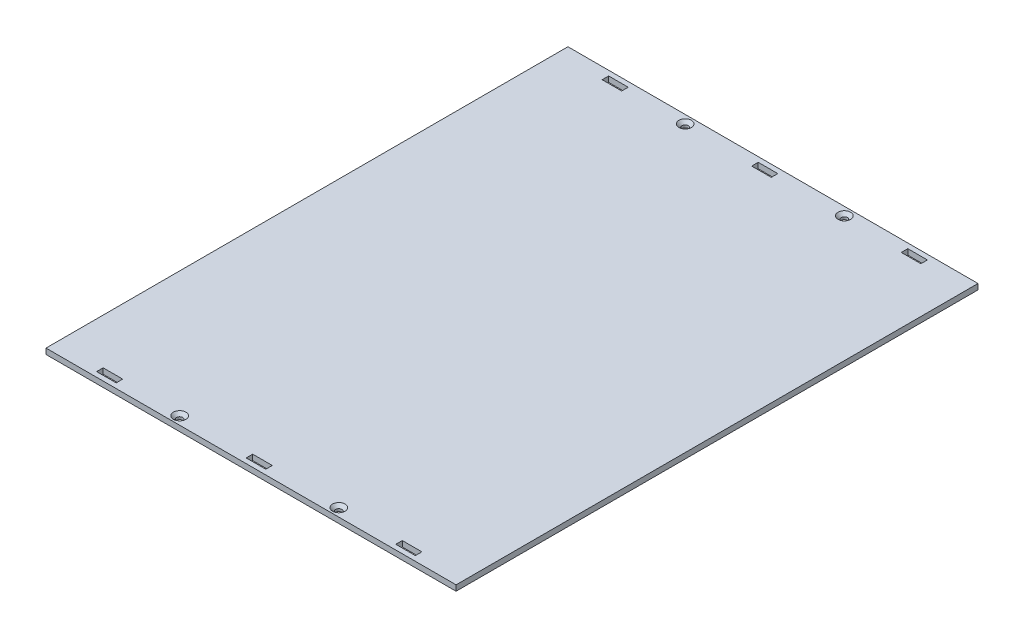
ISO-10303-21;
HEADER;
FILE_DESCRIPTION(('STEP AP214'),'2;1');
FILE_NAME('part.step','',(''),(''),'','','');
FILE_SCHEMA(('AUTOMOTIVE_DESIGN { 1 0 10303 214 1 1 1 1 }'));
ENDSEC;
DATA;
#1=APPLICATION_CONTEXT('core data for automotive mechanical design processes');
#2=APPLICATION_PROTOCOL_DEFINITION('international standard','automotive_design',2000,#1);
#3=PRODUCT_CONTEXT('',#1,'mechanical');
#4=PRODUCT('Part','Part','',(#3));
#5=PRODUCT_RELATED_PRODUCT_CATEGORY('part','',(#4));
#6=PRODUCT_DEFINITION_FORMATION('','',#4);
#7=PRODUCT_DEFINITION_CONTEXT('part definition',#1,'design');
#8=PRODUCT_DEFINITION('design','',#6,#7);
#9=PRODUCT_DEFINITION_SHAPE('','',#8);
#10=(LENGTH_UNIT() NAMED_UNIT(*) SI_UNIT(.MILLI.,.METRE.));
#11=(NAMED_UNIT(*) PLANE_ANGLE_UNIT() SI_UNIT($,.RADIAN.));
#12=(NAMED_UNIT(*) SI_UNIT($,.STERADIAN.) SOLID_ANGLE_UNIT());
#13=UNCERTAINTY_MEASURE_WITH_UNIT(LENGTH_MEASURE(1.E-05),#10,'distance_accuracy_value','');
#14=(GEOMETRIC_REPRESENTATION_CONTEXT(3) GLOBAL_UNCERTAINTY_ASSIGNED_CONTEXT((#13)) GLOBAL_UNIT_ASSIGNED_CONTEXT((#10,
#11,#12)) REPRESENTATION_CONTEXT('',''));
#15=CARTESIAN_POINT('',(0.,0.,0.));
#16=DIRECTION('',(0.,0.,1.));
#17=DIRECTION('',(1.,0.,0.));
#18=AXIS2_PLACEMENT_3D('',#15,#16,#17);
#19=CARTESIAN_POINT('',(0.,3.,0.));
#20=DIRECTION('',(0.,1.,0.));
#21=DIRECTION('',(0.,0.,1.));
#22=AXIS2_PLACEMENT_3D('',#19,#20,#21);
#23=PLANE('',#22);
#24=CARTESIAN_POINT('',(-42.7000000000001,3.,135.6));
#25=DIRECTION('',(0.,1.,0.));
#26=DIRECTION('',(0.,0.,1.));
#27=AXIS2_PLACEMENT_3D('',#24,#25,#26);
#28=CIRCLE('',#27,3.36);
#29=CARTESIAN_POINT('',(-42.7000000000001,3.,138.96));
#30=VERTEX_POINT('',#29);
#31=EDGE_CURVE('E801',#30,#30,#28,.T.);
#32=ORIENTED_EDGE('',*,*,#31,.F.);
#33=EDGE_LOOP('',(#32));
#34=FACE_BOUND('',#33,.T.);
#35=CARTESIAN_POINT('',(42.7,3.,135.6));
#36=DIRECTION('',(0.,1.,0.));
#37=DIRECTION('',(0.,0.,1.));
#38=AXIS2_PLACEMENT_3D('',#35,#36,#37);
#39=CIRCLE('',#38,3.36);
#40=CARTESIAN_POINT('',(42.7,3.,138.96));
#41=VERTEX_POINT('',#40);
#42=EDGE_CURVE('E808',#41,#41,#39,.T.);
#43=ORIENTED_EDGE('',*,*,#42,.F.);
#44=EDGE_LOOP('',(#43));
#45=FACE_BOUND('',#44,.T.);
#46=CARTESIAN_POINT('',(-42.7000000000001,3.,-135.6));
#47=DIRECTION('',(0.,1.,0.));
#48=DIRECTION('',(0.,0.,1.));
#49=AXIS2_PLACEMENT_3D('',#46,#47,#48);
#50=CIRCLE('',#49,3.36);
#51=CARTESIAN_POINT('',(-42.7000000000001,3.,-132.24));
#52=VERTEX_POINT('',#51);
#53=EDGE_CURVE('E817',#52,#52,#50,.T.);
#54=ORIENTED_EDGE('',*,*,#53,.F.);
#55=EDGE_LOOP('',(#54));
#56=FACE_BOUND('',#55,.T.);
#57=CARTESIAN_POINT('',(42.6999999999999,3.,-135.6));
#58=DIRECTION('',(0.,1.,0.));
#59=DIRECTION('',(0.,0.,1.));
#60=AXIS2_PLACEMENT_3D('',#57,#58,#59);
#61=CIRCLE('',#60,3.36);
#62=CARTESIAN_POINT('',(42.6999999999999,3.,-132.24));
#63=VERTEX_POINT('',#62);
#64=EDGE_CURVE('E826',#63,#63,#61,.T.);
#65=ORIENTED_EDGE('',*,*,#64,.F.);
#66=EDGE_LOOP('',(#65));
#67=FACE_BOUND('',#66,.T.);
#68=DIRECTION('',(0.,0.,1.));
#69=VECTOR('',#68,1.);
#70=CARTESIAN_POINT('',(-85.5,3.,-137.350000000001));
#71=LINE('',#70,#69);
#72=CARTESIAN_POINT('',(-85.5,3.,-137.350000000001));
#73=VERTEX_POINT('',#72);
#74=CARTESIAN_POINT('',(-85.5,3.,-133.850000000001));
#75=VERTEX_POINT('',#74);
#76=EDGE_CURVE('E232',#73,#75,#71,.T.);
#77=ORIENTED_EDGE('',*,*,#76,.F.);
#78=DIRECTION('',(-1.,0.,0.));
#79=VECTOR('',#78,1.);
#80=CARTESIAN_POINT('',(-85.5,3.,-137.350000000001));
#81=LINE('',#80,#79);
#82=CARTESIAN_POINT('',(-75.0000000000001,3.,-137.350000000001));
#83=VERTEX_POINT('',#82);
#84=EDGE_CURVE('E224',#83,#73,#81,.T.);
#85=ORIENTED_EDGE('',*,*,#84,.F.);
#86=DIRECTION('',(0.,0.,-1.));
#87=VECTOR('',#86,1.);
#88=CARTESIAN_POINT('',(-75.0000000000001,3.,-137.350000000001));
#89=LINE('',#88,#87);
#90=CARTESIAN_POINT('',(-75.0000000000001,3.,-133.850000000001));
#91=VERTEX_POINT('',#90);
#92=EDGE_CURVE('E247',#91,#83,#89,.T.);
#93=ORIENTED_EDGE('',*,*,#92,.F.);
#94=DIRECTION('',(1.,0.,0.));
#95=VECTOR('',#94,1.);
#96=CARTESIAN_POINT('',(-85.5,3.,-133.850000000001));
#97=LINE('',#96,#95);
#98=EDGE_CURVE('E245',#75,#91,#97,.T.);
#99=ORIENTED_EDGE('',*,*,#98,.F.);
#100=EDGE_LOOP('',(#77,#85,#93,#99));
#101=FACE_BOUND('',#100,.T.);
#102=DIRECTION('',(0.,0.,1.));
#103=VECTOR('',#102,1.);
#104=CARTESIAN_POINT('',(-5.25000000000006,3.,-137.35));
#105=LINE('',#104,#103);
#106=CARTESIAN_POINT('',(-5.25000000000006,3.,-137.35));
#107=VERTEX_POINT('',#106);
#108=CARTESIAN_POINT('',(-5.25000000000006,3.,-133.85));
#109=VERTEX_POINT('',#108);
#110=EDGE_CURVE('E296',#107,#109,#105,.T.);
#111=ORIENTED_EDGE('',*,*,#110,.F.);
#112=DIRECTION('',(-1.,0.,0.));
#113=VECTOR('',#112,1.);
#114=CARTESIAN_POINT('',(-5.25000000000006,3.,-137.35));
#115=LINE('',#114,#113);
#116=CARTESIAN_POINT('',(5.24999999999994,3.,-137.35));
#117=VERTEX_POINT('',#116);
#118=EDGE_CURVE('E294',#117,#107,#115,.T.);
#119=ORIENTED_EDGE('',*,*,#118,.F.);
#120=DIRECTION('',(0.,0.,-1.));
#121=VECTOR('',#120,1.);
#122=CARTESIAN_POINT('',(5.24999999999994,3.,-137.35));
#123=LINE('',#122,#121);
#124=CARTESIAN_POINT('',(5.24999999999995,3.,-133.85));
#125=VERTEX_POINT('',#124);
#126=EDGE_CURVE('E302',#125,#117,#123,.T.);
#127=ORIENTED_EDGE('',*,*,#126,.F.);
#128=DIRECTION('',(1.,0.,0.));
#129=VECTOR('',#128,1.);
#130=CARTESIAN_POINT('',(-5.25000000000006,3.,-133.85));
#131=LINE('',#130,#129);
#132=EDGE_CURVE('E299',#109,#125,#131,.T.);
#133=ORIENTED_EDGE('',*,*,#132,.F.);
#134=EDGE_LOOP('',(#111,#119,#127,#133));
#135=FACE_BOUND('',#134,.T.);
#136=DIRECTION('',(0.,0.,-1.));
#137=VECTOR('',#136,1.);
#138=CARTESIAN_POINT('',(85.5,3.,137.350000000001));
#139=LINE('',#138,#137);
#140=CARTESIAN_POINT('',(85.5,3.,137.350000000001));
#141=VERTEX_POINT('',#140);
#142=CARTESIAN_POINT('',(85.5,3.,133.850000000001));
#143=VERTEX_POINT('',#142);
#144=EDGE_CURVE('E327',#141,#143,#139,.T.);
#145=ORIENTED_EDGE('',*,*,#144,.F.);
#146=DIRECTION('',(1.,0.,0.));
#147=VECTOR('',#146,1.);
#148=CARTESIAN_POINT('',(85.5,3.,137.350000000001));
#149=LINE('',#148,#147);
#150=CARTESIAN_POINT('',(75.,3.,137.350000000001));
#151=VERTEX_POINT('',#150);
#152=EDGE_CURVE('E325',#151,#141,#149,.T.);
#153=ORIENTED_EDGE('',*,*,#152,.F.);
#154=DIRECTION('',(0.,0.,1.));
#155=VECTOR('',#154,1.);
#156=CARTESIAN_POINT('',(75.,3.,137.350000000001));
#157=LINE('',#156,#155);
#158=CARTESIAN_POINT('',(75.,3.,133.850000000001));
#159=VERTEX_POINT('',#158);
#160=EDGE_CURVE('E333',#159,#151,#157,.T.);
#161=ORIENTED_EDGE('',*,*,#160,.F.);
#162=DIRECTION('',(-1.,0.,0.));
#163=VECTOR('',#162,1.);
#164=CARTESIAN_POINT('',(85.5,3.,133.850000000001));
#165=LINE('',#164,#163);
#166=EDGE_CURVE('E330',#143,#159,#165,.T.);
#167=ORIENTED_EDGE('',*,*,#166,.F.);
#168=EDGE_LOOP('',(#145,#153,#161,#167));
#169=FACE_BOUND('',#168,.T.);
#170=DIRECTION('',(-1.,0.,0.));
#171=VECTOR('',#170,1.);
#172=CARTESIAN_POINT('',(-85.5,3.,133.850000000001));
#173=LINE('',#172,#171);
#174=CARTESIAN_POINT('',(-75.,3.,133.850000000001));
#175=VERTEX_POINT('',#174);
#176=CARTESIAN_POINT('',(-85.5,3.,133.850000000001));
#177=VERTEX_POINT('',#176);
#178=EDGE_CURVE('E358',#175,#177,#173,.T.);
#179=ORIENTED_EDGE('',*,*,#178,.F.);
#180=DIRECTION('',(0.,0.,-1.));
#181=VECTOR('',#180,1.);
#182=CARTESIAN_POINT('',(-75.,3.,137.350000000001));
#183=LINE('',#182,#181);
#184=CARTESIAN_POINT('',(-75.,3.,137.350000000001));
#185=VERTEX_POINT('',#184);
#186=EDGE_CURVE('E356',#185,#175,#183,.T.);
#187=ORIENTED_EDGE('',*,*,#186,.F.);
#188=DIRECTION('',(1.,0.,0.));
#189=VECTOR('',#188,1.);
#190=CARTESIAN_POINT('',(-85.5,3.,137.350000000001));
#191=LINE('',#190,#189);
#192=CARTESIAN_POINT('',(-85.5,3.,137.350000000001));
#193=VERTEX_POINT('',#192);
#194=EDGE_CURVE('E364',#193,#185,#191,.T.);
#195=ORIENTED_EDGE('',*,*,#194,.F.);
#196=DIRECTION('',(0.,0.,1.));
#197=VECTOR('',#196,1.);
#198=CARTESIAN_POINT('',(-85.5,3.,137.350000000001));
#199=LINE('',#198,#197);
#200=EDGE_CURVE('E361',#177,#193,#199,.T.);
#201=ORIENTED_EDGE('',*,*,#200,.F.);
#202=EDGE_LOOP('',(#179,#187,#195,#201));
#203=FACE_BOUND('',#202,.T.);
#204=DIRECTION('',(0.,0.,1.));
#205=VECTOR('',#204,1.);
#206=CARTESIAN_POINT('',(-110.,3.,140.));
#207=LINE('',#206,#205);
#208=CARTESIAN_POINT('',(-110.,3.,-140.));
#209=VERTEX_POINT('',#208);
#210=CARTESIAN_POINT('',(-110.,3.,140.));
#211=VERTEX_POINT('',#210);
#212=EDGE_CURVE('E418',#209,#211,#207,.T.);
#213=ORIENTED_EDGE('',*,*,#212,.T.);
#214=DIRECTION('',(1.,0.,0.));
#215=VECTOR('',#214,1.);
#216=CARTESIAN_POINT('',(110.,3.,140.));
#217=LINE('',#216,#215);
#218=CARTESIAN_POINT('',(110.,3.,140.));
#219=VERTEX_POINT('',#218);
#220=EDGE_CURVE('E421',#211,#219,#217,.T.);
#221=ORIENTED_EDGE('',*,*,#220,.T.);
#222=DIRECTION('',(0.,0.,-1.));
#223=VECTOR('',#222,1.);
#224=CARTESIAN_POINT('',(110.,3.,140.));
#225=LINE('',#224,#223);
#226=CARTESIAN_POINT('',(110.,3.,-140.));
#227=VERTEX_POINT('',#226);
#228=EDGE_CURVE('E424',#219,#227,#225,.T.);
#229=ORIENTED_EDGE('',*,*,#228,.T.);
#230=DIRECTION('',(-1.,0.,0.));
#231=VECTOR('',#230,1.);
#232=CARTESIAN_POINT('',(110.,3.,-140.));
#233=LINE('',#232,#231);
#234=EDGE_CURVE('E426',#227,#209,#233,.T.);
#235=ORIENTED_EDGE('',*,*,#234,.T.);
#236=EDGE_LOOP('',(#213,#221,#229,#235));
#237=FACE_BOUND('',#236,.T.);
#238=DIRECTION('',(-1.,0.,0.));
#239=VECTOR('',#238,1.);
#240=CARTESIAN_POINT('',(-5.25000000000002,3.,133.85));
#241=LINE('',#240,#239);
#242=CARTESIAN_POINT('',(5.24999999999998,3.,133.85));
#243=VERTEX_POINT('',#242);
#244=CARTESIAN_POINT('',(-5.25000000000002,3.,133.85));
#245=VERTEX_POINT('',#244);
#246=EDGE_CURVE('E389',#243,#245,#241,.T.);
#247=ORIENTED_EDGE('',*,*,#246,.F.);
#248=DIRECTION('',(0.,0.,-1.));
#249=VECTOR('',#248,1.);
#250=CARTESIAN_POINT('',(5.24999999999998,3.,137.35));
#251=LINE('',#250,#249);
#252=CARTESIAN_POINT('',(5.24999999999998,3.,137.35));
#253=VERTEX_POINT('',#252);
#254=EDGE_CURVE('E387',#253,#243,#251,.T.);
#255=ORIENTED_EDGE('',*,*,#254,.F.);
#256=DIRECTION('',(1.,0.,0.));
#257=VECTOR('',#256,1.);
#258=CARTESIAN_POINT('',(-5.25000000000002,3.,137.35));
#259=LINE('',#258,#257);
#260=CARTESIAN_POINT('',(-5.25000000000002,3.,137.35));
#261=VERTEX_POINT('',#260);
#262=EDGE_CURVE('E395',#261,#253,#259,.T.);
#263=ORIENTED_EDGE('',*,*,#262,.F.);
#264=DIRECTION('',(0.,0.,1.));
#265=VECTOR('',#264,1.);
#266=CARTESIAN_POINT('',(-5.25000000000002,3.,137.35));
#267=LINE('',#266,#265);
#268=EDGE_CURVE('E392',#245,#261,#267,.T.);
#269=ORIENTED_EDGE('',*,*,#268,.F.);
#270=EDGE_LOOP('',(#247,#255,#263,#269));
#271=FACE_BOUND('',#270,.T.);
#272=DIRECTION('',(-1.,0.,0.));
#273=VECTOR('',#272,1.);
#274=CARTESIAN_POINT('',(85.4999999999999,3.,-137.350000000001));
#275=LINE('',#274,#273);
#276=CARTESIAN_POINT('',(85.4999999999999,3.,-137.350000000001));
#277=VERTEX_POINT('',#276);
#278=CARTESIAN_POINT('',(74.9999999999999,3.,-137.350000000001));
#279=VERTEX_POINT('',#278);
#280=EDGE_CURVE('E265',#277,#279,#275,.T.);
#281=ORIENTED_EDGE('',*,*,#280,.F.);
#282=DIRECTION('',(0.,0.,-1.));
#283=VECTOR('',#282,1.);
#284=CARTESIAN_POINT('',(85.4999999999999,3.,-137.350000000001));
#285=LINE('',#284,#283);
#286=CARTESIAN_POINT('',(85.4999999999999,3.,-133.850000000001));
#287=VERTEX_POINT('',#286);
#288=EDGE_CURVE('E263',#287,#277,#285,.T.);
#289=ORIENTED_EDGE('',*,*,#288,.F.);
#290=DIRECTION('',(1.,0.,0.));
#291=VECTOR('',#290,1.);
#292=CARTESIAN_POINT('',(85.4999999999999,3.,-133.850000000001));
#293=LINE('',#292,#291);
#294=CARTESIAN_POINT('',(74.9999999999999,3.,-133.850000000001));
#295=VERTEX_POINT('',#294);
#296=EDGE_CURVE('E271',#295,#287,#293,.T.);
#297=ORIENTED_EDGE('',*,*,#296,.F.);
#298=DIRECTION('',(0.,0.,1.));
#299=VECTOR('',#298,1.);
#300=CARTESIAN_POINT('',(74.9999999999999,3.,-137.350000000001));
#301=LINE('',#300,#299);
#302=EDGE_CURVE('E268',#279,#295,#301,.T.);
#303=ORIENTED_EDGE('',*,*,#302,.F.);
#304=EDGE_LOOP('',(#281,#289,#297,#303));
#305=FACE_BOUND('',#304,.T.);
#306=ADVANCED_FACE('F39',(#34,#45,#56,#67,#101,#135,#169,#203,#237,#271,#305),#23,.T.);
#307=CARTESIAN_POINT('',(0.,0.,0.));
#308=DIRECTION('',(0.,1.,0.));
#309=DIRECTION('',(0.,0.,1.));
#310=AXIS2_PLACEMENT_3D('',#307,#308,#309);
#311=PLANE('',#310);
#312=CARTESIAN_POINT('',(-42.7000000000001,0.,135.6));
#313=DIRECTION('',(0.,1.,0.));
#314=DIRECTION('',(0.,0.,1.));
#315=AXIS2_PLACEMENT_3D('',#312,#313,#314);
#316=CIRCLE('',#315,1.7);
#317=CARTESIAN_POINT('',(-42.7000000000001,0.,137.3));
#318=VERTEX_POINT('',#317);
#319=EDGE_CURVE('E803',#318,#318,#316,.T.);
#320=ORIENTED_EDGE('',*,*,#319,.T.);
#321=EDGE_LOOP('',(#320));
#322=FACE_BOUND('',#321,.T.);
#323=CARTESIAN_POINT('',(42.7,0.,135.6));
#324=DIRECTION('',(0.,1.,0.));
#325=DIRECTION('',(0.,0.,1.));
#326=AXIS2_PLACEMENT_3D('',#323,#324,#325);
#327=CIRCLE('',#326,1.7);
#328=CARTESIAN_POINT('',(42.7,0.,137.3));
#329=VERTEX_POINT('',#328);
#330=EDGE_CURVE('E814',#329,#329,#327,.T.);
#331=ORIENTED_EDGE('',*,*,#330,.T.);
#332=EDGE_LOOP('',(#331));
#333=FACE_BOUND('',#332,.T.);
#334=CARTESIAN_POINT('',(-42.7000000000001,0.,-135.6));
#335=DIRECTION('',(0.,1.,0.));
#336=DIRECTION('',(0.,0.,1.));
#337=AXIS2_PLACEMENT_3D('',#334,#335,#336);
#338=CIRCLE('',#337,1.7);
#339=CARTESIAN_POINT('',(-42.7000000000001,0.,-133.9));
#340=VERTEX_POINT('',#339);
#341=EDGE_CURVE('E823',#340,#340,#338,.T.);
#342=ORIENTED_EDGE('',*,*,#341,.T.);
#343=EDGE_LOOP('',(#342));
#344=FACE_BOUND('',#343,.T.);
#345=CARTESIAN_POINT('',(42.6999999999999,0.,-135.6));
#346=DIRECTION('',(0.,1.,0.));
#347=DIRECTION('',(0.,0.,1.));
#348=AXIS2_PLACEMENT_3D('',#345,#346,#347);
#349=CIRCLE('',#348,1.7);
#350=CARTESIAN_POINT('',(42.6999999999999,0.,-133.9));
#351=VERTEX_POINT('',#350);
#352=EDGE_CURVE('E253',#351,#351,#349,.T.);
#353=ORIENTED_EDGE('',*,*,#352,.T.);
#354=EDGE_LOOP('',(#353));
#355=FACE_BOUND('',#354,.T.);
#356=DIRECTION('',(0.,0.,-1.));
#357=VECTOR('',#356,1.);
#358=CARTESIAN_POINT('',(85.4999999999999,0.,-137.350000000001));
#359=LINE('',#358,#357);
#360=CARTESIAN_POINT('',(85.4999999999999,0.,-133.850000000001));
#361=VERTEX_POINT('',#360);
#362=CARTESIAN_POINT('',(85.4999999999999,0.,-137.350000000001));
#363=VERTEX_POINT('',#362);
#364=EDGE_CURVE('E240',#361,#363,#359,.T.);
#365=ORIENTED_EDGE('',*,*,#364,.T.);
#366=DIRECTION('',(-1.,0.,0.));
#367=VECTOR('',#366,1.);
#368=CARTESIAN_POINT('',(85.4999999999999,0.,-137.350000000001));
#369=LINE('',#368,#367);
#370=CARTESIAN_POINT('',(74.9999999999999,0.,-137.350000000001));
#371=VERTEX_POINT('',#370);
#372=EDGE_CURVE('E276',#363,#371,#369,.T.);
#373=ORIENTED_EDGE('',*,*,#372,.T.);
#374=DIRECTION('',(0.,0.,1.));
#375=VECTOR('',#374,1.);
#376=CARTESIAN_POINT('',(74.9999999999999,0.,-137.350000000001));
#377=LINE('',#376,#375);
#378=CARTESIAN_POINT('',(74.9999999999999,0.,-133.850000000001));
#379=VERTEX_POINT('',#378);
#380=EDGE_CURVE('E279',#371,#379,#377,.T.);
#381=ORIENTED_EDGE('',*,*,#380,.T.);
#382=DIRECTION('',(1.,0.,0.));
#383=VECTOR('',#382,1.);
#384=CARTESIAN_POINT('',(85.4999999999999,0.,-133.850000000001));
#385=LINE('',#384,#383);
#386=EDGE_CURVE('E266',#379,#361,#385,.T.);
#387=ORIENTED_EDGE('',*,*,#386,.T.);
#388=EDGE_LOOP('',(#365,#373,#381,#387));
#389=FACE_BOUND('',#388,.T.);
#390=DIRECTION('',(1.,0.,0.));
#391=VECTOR('',#390,1.);
#392=CARTESIAN_POINT('',(85.5,0.,137.350000000001));
#393=LINE('',#392,#391);
#394=CARTESIAN_POINT('',(75.,0.,137.350000000001));
#395=VERTEX_POINT('',#394);
#396=CARTESIAN_POINT('',(85.5,0.,137.350000000001));
#397=VERTEX_POINT('',#396);
#398=EDGE_CURVE('E324',#395,#397,#393,.T.);
#399=ORIENTED_EDGE('',*,*,#398,.T.);
#400=DIRECTION('',(0.,0.,-1.));
#401=VECTOR('',#400,1.);
#402=CARTESIAN_POINT('',(85.5,0.,137.350000000001));
#403=LINE('',#402,#401);
#404=CARTESIAN_POINT('',(85.5,0.,133.850000000001));
#405=VERTEX_POINT('',#404);
#406=EDGE_CURVE('E338',#397,#405,#403,.T.);
#407=ORIENTED_EDGE('',*,*,#406,.T.);
#408=DIRECTION('',(-1.,0.,0.));
#409=VECTOR('',#408,1.);
#410=CARTESIAN_POINT('',(85.5,0.,133.850000000001));
#411=LINE('',#410,#409);
#412=CARTESIAN_POINT('',(75.,0.,133.850000000001));
#413=VERTEX_POINT('',#412);
#414=EDGE_CURVE('E341',#405,#413,#411,.T.);
#415=ORIENTED_EDGE('',*,*,#414,.T.);
#416=DIRECTION('',(0.,0.,1.));
#417=VECTOR('',#416,1.);
#418=CARTESIAN_POINT('',(75.,0.,137.350000000001));
#419=LINE('',#418,#417);
#420=EDGE_CURVE('E328',#413,#395,#419,.T.);
#421=ORIENTED_EDGE('',*,*,#420,.T.);
#422=EDGE_LOOP('',(#399,#407,#415,#421));
#423=FACE_BOUND('',#422,.T.);
#424=DIRECTION('',(0.,0.,-1.));
#425=VECTOR('',#424,1.);
#426=CARTESIAN_POINT('',(5.24999999999998,0.,137.35));
#427=LINE('',#426,#425);
#428=CARTESIAN_POINT('',(5.24999999999998,0.,137.35));
#429=VERTEX_POINT('',#428);
#430=CARTESIAN_POINT('',(5.24999999999998,0.,133.85));
#431=VERTEX_POINT('',#430);
#432=EDGE_CURVE('E386',#429,#431,#427,.T.);
#433=ORIENTED_EDGE('',*,*,#432,.T.);
#434=DIRECTION('',(-1.,0.,0.));
#435=VECTOR('',#434,1.);
#436=CARTESIAN_POINT('',(-5.25000000000002,0.,133.85));
#437=LINE('',#436,#435);
#438=CARTESIAN_POINT('',(-5.25000000000002,0.,133.85));
#439=VERTEX_POINT('',#438);
#440=EDGE_CURVE('E400',#431,#439,#437,.T.);
#441=ORIENTED_EDGE('',*,*,#440,.T.);
#442=DIRECTION('',(0.,0.,1.));
#443=VECTOR('',#442,1.);
#444=CARTESIAN_POINT('',(-5.25000000000002,0.,137.35));
#445=LINE('',#444,#443);
#446=CARTESIAN_POINT('',(-5.25000000000002,0.,137.35));
#447=VERTEX_POINT('',#446);
#448=EDGE_CURVE('E403',#439,#447,#445,.T.);
#449=ORIENTED_EDGE('',*,*,#448,.T.);
#450=DIRECTION('',(1.,0.,0.));
#451=VECTOR('',#450,1.);
#452=CARTESIAN_POINT('',(-5.25000000000002,0.,137.35));
#453=LINE('',#452,#451);
#454=EDGE_CURVE('E390',#447,#429,#453,.T.);
#455=ORIENTED_EDGE('',*,*,#454,.T.);
#456=EDGE_LOOP('',(#433,#441,#449,#455));
#457=FACE_BOUND('',#456,.T.);
#458=DIRECTION('',(0.,0.,1.));
#459=VECTOR('',#458,1.);
#460=CARTESIAN_POINT('',(-110.,0.,140.));
#461=LINE('',#460,#459);
#462=CARTESIAN_POINT('',(-110.,0.,-140.));
#463=VERTEX_POINT('',#462);
#464=CARTESIAN_POINT('',(-110.,0.,140.));
#465=VERTEX_POINT('',#464);
#466=EDGE_CURVE('E417',#463,#465,#461,.T.);
#467=ORIENTED_EDGE('',*,*,#466,.F.);
#468=DIRECTION('',(-1.,0.,0.));
#469=VECTOR('',#468,1.);
#470=CARTESIAN_POINT('',(110.,0.,-140.));
#471=LINE('',#470,#469);
#472=CARTESIAN_POINT('',(110.,0.,-140.));
#473=VERTEX_POINT('',#472);
#474=EDGE_CURVE('E422',#473,#463,#471,.T.);
#475=ORIENTED_EDGE('',*,*,#474,.F.);
#476=DIRECTION('',(0.,0.,-1.));
#477=VECTOR('',#476,1.);
#478=CARTESIAN_POINT('',(110.,0.,140.));
#479=LINE('',#478,#477);
#480=CARTESIAN_POINT('',(110.,0.,140.));
#481=VERTEX_POINT('',#480);
#482=EDGE_CURVE('E433',#481,#473,#479,.T.);
#483=ORIENTED_EDGE('',*,*,#482,.F.);
#484=DIRECTION('',(1.,0.,0.));
#485=VECTOR('',#484,1.);
#486=CARTESIAN_POINT('',(110.,0.,140.));
#487=LINE('',#486,#485);
#488=EDGE_CURVE('E431',#465,#481,#487,.T.);
#489=ORIENTED_EDGE('',*,*,#488,.F.);
#490=EDGE_LOOP('',(#467,#475,#483,#489));
#491=FACE_BOUND('',#490,.T.);
#492=DIRECTION('',(0.,0.,-1.));
#493=VECTOR('',#492,1.);
#494=CARTESIAN_POINT('',(-75.,0.,137.350000000001));
#495=LINE('',#494,#493);
#496=CARTESIAN_POINT('',(-75.,0.,137.350000000001));
#497=VERTEX_POINT('',#496);
#498=CARTESIAN_POINT('',(-75.,0.,133.850000000001));
#499=VERTEX_POINT('',#498);
#500=EDGE_CURVE('E355',#497,#499,#495,.T.);
#501=ORIENTED_EDGE('',*,*,#500,.T.);
#502=DIRECTION('',(-1.,0.,0.));
#503=VECTOR('',#502,1.);
#504=CARTESIAN_POINT('',(-85.5,0.,133.850000000001));
#505=LINE('',#504,#503);
#506=CARTESIAN_POINT('',(-85.5,0.,133.850000000001));
#507=VERTEX_POINT('',#506);
#508=EDGE_CURVE('E369',#499,#507,#505,.T.);
#509=ORIENTED_EDGE('',*,*,#508,.T.);
#510=DIRECTION('',(0.,0.,1.));
#511=VECTOR('',#510,1.);
#512=CARTESIAN_POINT('',(-85.5,0.,137.350000000001));
#513=LINE('',#512,#511);
#514=CARTESIAN_POINT('',(-85.5,0.,137.350000000001));
#515=VERTEX_POINT('',#514);
#516=EDGE_CURVE('E372',#507,#515,#513,.T.);
#517=ORIENTED_EDGE('',*,*,#516,.T.);
#518=DIRECTION('',(1.,0.,0.));
#519=VECTOR('',#518,1.);
#520=CARTESIAN_POINT('',(-85.5,0.,137.350000000001));
#521=LINE('',#520,#519);
#522=EDGE_CURVE('E359',#515,#497,#521,.T.);
#523=ORIENTED_EDGE('',*,*,#522,.T.);
#524=EDGE_LOOP('',(#501,#509,#517,#523));
#525=FACE_BOUND('',#524,.T.);
#526=DIRECTION('',(-1.,0.,0.));
#527=VECTOR('',#526,1.);
#528=CARTESIAN_POINT('',(-5.25000000000006,0.,-137.35));
#529=LINE('',#528,#527);
#530=CARTESIAN_POINT('',(5.24999999999994,0.,-137.35));
#531=VERTEX_POINT('',#530);
#532=CARTESIAN_POINT('',(-5.25000000000006,0.,-137.35));
#533=VERTEX_POINT('',#532);
#534=EDGE_CURVE('E293',#531,#533,#529,.T.);
#535=ORIENTED_EDGE('',*,*,#534,.T.);
#536=DIRECTION('',(0.,0.,1.));
#537=VECTOR('',#536,1.);
#538=CARTESIAN_POINT('',(-5.25000000000006,0.,-137.35));
#539=LINE('',#538,#537);
#540=CARTESIAN_POINT('',(-5.25000000000006,0.,-133.85));
#541=VERTEX_POINT('',#540);
#542=EDGE_CURVE('E307',#533,#541,#539,.T.);
#543=ORIENTED_EDGE('',*,*,#542,.T.);
#544=DIRECTION('',(1.,0.,0.));
#545=VECTOR('',#544,1.);
#546=CARTESIAN_POINT('',(-5.25000000000006,0.,-133.85));
#547=LINE('',#546,#545);
#548=CARTESIAN_POINT('',(5.24999999999995,0.,-133.85));
#549=VERTEX_POINT('',#548);
#550=EDGE_CURVE('E310',#541,#549,#547,.T.);
#551=ORIENTED_EDGE('',*,*,#550,.T.);
#552=DIRECTION('',(0.,0.,-1.));
#553=VECTOR('',#552,1.);
#554=CARTESIAN_POINT('',(5.24999999999994,0.,-137.35));
#555=LINE('',#554,#553);
#556=EDGE_CURVE('E297',#549,#531,#555,.T.);
#557=ORIENTED_EDGE('',*,*,#556,.T.);
#558=EDGE_LOOP('',(#535,#543,#551,#557));
#559=FACE_BOUND('',#558,.T.);
#560=DIRECTION('',(-1.,0.,0.));
#561=VECTOR('',#560,1.);
#562=CARTESIAN_POINT('',(-85.5,0.,-137.350000000001));
#563=LINE('',#562,#561);
#564=CARTESIAN_POINT('',(-75.0000000000001,0.,-137.350000000001));
#565=VERTEX_POINT('',#564);
#566=CARTESIAN_POINT('',(-85.5,0.,-137.350000000001));
#567=VERTEX_POINT('',#566);
#568=EDGE_CURVE('E62',#565,#567,#563,.T.);
#569=ORIENTED_EDGE('',*,*,#568,.T.);
#570=DIRECTION('',(0.,0.,1.));
#571=VECTOR('',#570,1.);
#572=CARTESIAN_POINT('',(-85.5,0.,-137.350000000001));
#573=LINE('',#572,#571);
#574=CARTESIAN_POINT('',(-85.5,0.,-133.850000000001));
#575=VERTEX_POINT('',#574);
#576=EDGE_CURVE('E239',#567,#575,#573,.T.);
#577=ORIENTED_EDGE('',*,*,#576,.T.);
#578=DIRECTION('',(1.,0.,0.));
#579=VECTOR('',#578,1.);
#580=CARTESIAN_POINT('',(-85.5,0.,-133.850000000001));
#581=LINE('',#580,#579);
#582=CARTESIAN_POINT('',(-75.0000000000001,0.,-133.850000000001));
#583=VERTEX_POINT('',#582);
#584=EDGE_CURVE('E255',#575,#583,#581,.T.);
#585=ORIENTED_EDGE('',*,*,#584,.T.);
#586=DIRECTION('',(0.,0.,-1.));
#587=VECTOR('',#586,1.);
#588=CARTESIAN_POINT('',(-75.0000000000001,0.,-137.350000000001));
#589=LINE('',#588,#587);
#590=EDGE_CURVE('E233',#583,#565,#589,.T.);
#591=ORIENTED_EDGE('',*,*,#590,.T.);
#592=EDGE_LOOP('',(#569,#577,#585,#591));
#593=FACE_BOUND('',#592,.T.);
#594=ADVANCED_FACE('F451',(#322,#333,#344,#355,#389,#423,#457,#491,#525,#559,#593),#311,.F.);
#595=CARTESIAN_POINT('',(-110.,3.,140.));
#596=DIRECTION('',(1.,0.,0.));
#597=DIRECTION('',(0.,0.,-1.));
#598=AXIS2_PLACEMENT_3D('',#595,#596,#597);
#599=PLANE('',#598);
#600=ORIENTED_EDGE('',*,*,#466,.T.);
#601=DIRECTION('',(0.,-1.,0.));
#602=VECTOR('',#601,1.);
#603=CARTESIAN_POINT('',(-110.,3.,140.));
#604=LINE('',#603,#602);
#605=EDGE_CURVE('E11',#211,#465,#604,.T.);
#606=ORIENTED_EDGE('',*,*,#605,.F.);
#607=ORIENTED_EDGE('',*,*,#212,.F.);
#608=DIRECTION('',(0.,-1.,0.));
#609=VECTOR('',#608,1.);
#610=CARTESIAN_POINT('',(-110.,3.,-140.));
#611=LINE('',#610,#609);
#612=EDGE_CURVE('E428',#209,#463,#611,.T.);
#613=ORIENTED_EDGE('',*,*,#612,.T.);
#614=EDGE_LOOP('',(#600,#606,#607,#613));
#615=FACE_BOUND('',#614,.T.);
#616=ADVANCED_FACE('F41',(#615),#599,.F.);
#617=CARTESIAN_POINT('',(110.,3.,140.));
#618=DIRECTION('',(0.,0.,-1.));
#619=DIRECTION('',(-1.,0.,0.));
#620=AXIS2_PLACEMENT_3D('',#617,#618,#619);
#621=PLANE('',#620);
#622=ORIENTED_EDGE('',*,*,#488,.T.);
#623=DIRECTION('',(0.,-1.,0.));
#624=VECTOR('',#623,1.);
#625=CARTESIAN_POINT('',(110.,3.,140.));
#626=LINE('',#625,#624);
#627=EDGE_CURVE('E47',#219,#481,#626,.T.);
#628=ORIENTED_EDGE('',*,*,#627,.F.);
#629=ORIENTED_EDGE('',*,*,#220,.F.);
#630=ORIENTED_EDGE('',*,*,#605,.T.);
#631=EDGE_LOOP('',(#622,#628,#629,#630));
#632=FACE_BOUND('',#631,.T.);
#633=ADVANCED_FACE('F462',(#632),#621,.F.);
#634=CARTESIAN_POINT('',(110.,3.,140.));
#635=DIRECTION('',(-1.,0.,0.));
#636=DIRECTION('',(0.,0.,1.));
#637=AXIS2_PLACEMENT_3D('',#634,#635,#636);
#638=PLANE('',#637);
#639=ORIENTED_EDGE('',*,*,#482,.T.);
#640=DIRECTION('',(0.,-1.,0.));
#641=VECTOR('',#640,1.);
#642=CARTESIAN_POINT('',(110.,3.,-140.));
#643=LINE('',#642,#641);
#644=EDGE_CURVE('E438',#227,#473,#643,.T.);
#645=ORIENTED_EDGE('',*,*,#644,.F.);
#646=ORIENTED_EDGE('',*,*,#228,.F.);
#647=ORIENTED_EDGE('',*,*,#627,.T.);
#648=EDGE_LOOP('',(#639,#645,#646,#647));
#649=FACE_BOUND('',#648,.T.);
#650=ADVANCED_FACE('F445',(#649),#638,.F.);
#651=CARTESIAN_POINT('',(110.,3.,-140.));
#652=DIRECTION('',(0.,0.,1.));
#653=DIRECTION('',(1.,0.,0.));
#654=AXIS2_PLACEMENT_3D('',#651,#652,#653);
#655=PLANE('',#654);
#656=ORIENTED_EDGE('',*,*,#474,.T.);
#657=ORIENTED_EDGE('',*,*,#612,.F.);
#658=ORIENTED_EDGE('',*,*,#234,.F.);
#659=ORIENTED_EDGE('',*,*,#644,.T.);
#660=EDGE_LOOP('',(#656,#657,#658,#659));
#661=FACE_BOUND('',#660,.T.);
#662=ADVANCED_FACE('F455',(#661),#655,.F.);
#663=CARTESIAN_POINT('',(5.24999999999998,3.,137.35));
#664=DIRECTION('',(-1.,0.,0.));
#665=DIRECTION('',(0.,0.,1.));
#666=AXIS2_PLACEMENT_3D('',#663,#664,#665);
#667=PLANE('',#666);
#668=ORIENTED_EDGE('',*,*,#432,.F.);
#669=DIRECTION('',(0.,-1.,0.));
#670=VECTOR('',#669,1.);
#671=CARTESIAN_POINT('',(5.24999999999998,3.,137.35));
#672=LINE('',#671,#670);
#673=EDGE_CURVE('E397',#253,#429,#672,.T.);
#674=ORIENTED_EDGE('',*,*,#673,.F.);
#675=ORIENTED_EDGE('',*,*,#254,.T.);
#676=DIRECTION('',(0.,-1.,0.));
#677=VECTOR('',#676,1.);
#678=CARTESIAN_POINT('',(5.24999999999998,3.,133.85));
#679=LINE('',#678,#677);
#680=EDGE_CURVE('E414',#243,#431,#679,.T.);
#681=ORIENTED_EDGE('',*,*,#680,.T.);
#682=EDGE_LOOP('',(#668,#674,#675,#681));
#683=FACE_BOUND('',#682,.T.);
#684=ADVANCED_FACE('F481',(#683),#667,.T.);
#685=CARTESIAN_POINT('',(-5.25000000000002,3.,133.85));
#686=DIRECTION('',(0.,0.,1.));
#687=DIRECTION('',(1.,0.,0.));
#688=AXIS2_PLACEMENT_3D('',#685,#686,#687);
#689=PLANE('',#688);
#690=ORIENTED_EDGE('',*,*,#440,.F.);
#691=ORIENTED_EDGE('',*,*,#680,.F.);
#692=ORIENTED_EDGE('',*,*,#246,.T.);
#693=DIRECTION('',(0.,-1.,0.));
#694=VECTOR('',#693,1.);
#695=CARTESIAN_POINT('',(-5.25000000000002,3.,133.85));
#696=LINE('',#695,#694);
#697=EDGE_CURVE('E412',#245,#439,#696,.T.);
#698=ORIENTED_EDGE('',*,*,#697,.T.);
#699=EDGE_LOOP('',(#690,#691,#692,#698));
#700=FACE_BOUND('',#699,.T.);
#701=ADVANCED_FACE('F488',(#700),#689,.T.);
#702=CARTESIAN_POINT('',(-5.25000000000002,3.,137.35));
#703=DIRECTION('',(1.,0.,0.));
#704=DIRECTION('',(0.,0.,-1.));
#705=AXIS2_PLACEMENT_3D('',#702,#703,#704);
#706=PLANE('',#705);
#707=ORIENTED_EDGE('',*,*,#448,.F.);
#708=ORIENTED_EDGE('',*,*,#697,.F.);
#709=ORIENTED_EDGE('',*,*,#268,.T.);
#710=DIRECTION('',(0.,-1.,0.));
#711=VECTOR('',#710,1.);
#712=CARTESIAN_POINT('',(-5.25000000000002,3.,137.35));
#713=LINE('',#712,#711);
#714=EDGE_CURVE('E410',#261,#447,#713,.T.);
#715=ORIENTED_EDGE('',*,*,#714,.T.);
#716=EDGE_LOOP('',(#707,#708,#709,#715));
#717=FACE_BOUND('',#716,.T.);
#718=ADVANCED_FACE('F493',(#717),#706,.T.);
#719=CARTESIAN_POINT('',(-5.25000000000002,3.,137.35));
#720=DIRECTION('',(0.,0.,-1.));
#721=DIRECTION('',(-1.,0.,0.));
#722=AXIS2_PLACEMENT_3D('',#719,#720,#721);
#723=PLANE('',#722);
#724=ORIENTED_EDGE('',*,*,#454,.F.);
#725=ORIENTED_EDGE('',*,*,#714,.F.);
#726=ORIENTED_EDGE('',*,*,#262,.T.);
#727=ORIENTED_EDGE('',*,*,#673,.T.);
#728=EDGE_LOOP('',(#724,#725,#726,#727));
#729=FACE_BOUND('',#728,.T.);
#730=ADVANCED_FACE('F501',(#729),#723,.T.);
#731=CARTESIAN_POINT('',(-75.,3.,137.350000000001));
#732=DIRECTION('',(-1.,0.,0.));
#733=DIRECTION('',(0.,0.,1.));
#734=AXIS2_PLACEMENT_3D('',#731,#732,#733);
#735=PLANE('',#734);
#736=ORIENTED_EDGE('',*,*,#500,.F.);
#737=DIRECTION('',(0.,-1.,0.));
#738=VECTOR('',#737,1.);
#739=CARTESIAN_POINT('',(-75.,3.,137.350000000001));
#740=LINE('',#739,#738);
#741=EDGE_CURVE('E366',#185,#497,#740,.T.);
#742=ORIENTED_EDGE('',*,*,#741,.F.);
#743=ORIENTED_EDGE('',*,*,#186,.T.);
#744=DIRECTION('',(0.,-1.,0.));
#745=VECTOR('',#744,1.);
#746=CARTESIAN_POINT('',(-75.,3.,133.850000000001));
#747=LINE('',#746,#745);
#748=EDGE_CURVE('E383',#175,#499,#747,.T.);
#749=ORIENTED_EDGE('',*,*,#748,.T.);
#750=EDGE_LOOP('',(#736,#742,#743,#749));
#751=FACE_BOUND('',#750,.T.);
#752=ADVANCED_FACE('F585',(#751),#735,.T.);
#753=CARTESIAN_POINT('',(-85.5,3.,133.850000000001));
#754=DIRECTION('',(0.,0.,1.));
#755=DIRECTION('',(1.,0.,0.));
#756=AXIS2_PLACEMENT_3D('',#753,#754,#755);
#757=PLANE('',#756);
#758=ORIENTED_EDGE('',*,*,#508,.F.);
#759=ORIENTED_EDGE('',*,*,#748,.F.);
#760=ORIENTED_EDGE('',*,*,#178,.T.);
#761=DIRECTION('',(0.,-1.,0.));
#762=VECTOR('',#761,1.);
#763=CARTESIAN_POINT('',(-85.5,3.,133.850000000001));
#764=LINE('',#763,#762);
#765=EDGE_CURVE('E381',#177,#507,#764,.T.);
#766=ORIENTED_EDGE('',*,*,#765,.T.);
#767=EDGE_LOOP('',(#758,#759,#760,#766));
#768=FACE_BOUND('',#767,.T.);
#769=ADVANCED_FACE('F581',(#768),#757,.T.);
#770=CARTESIAN_POINT('',(-85.5,3.,137.350000000001));
#771=DIRECTION('',(1.,0.,0.));
#772=DIRECTION('',(0.,0.,-1.));
#773=AXIS2_PLACEMENT_3D('',#770,#771,#772);
#774=PLANE('',#773);
#775=ORIENTED_EDGE('',*,*,#516,.F.);
#776=ORIENTED_EDGE('',*,*,#765,.F.);
#777=ORIENTED_EDGE('',*,*,#200,.T.);
#778=DIRECTION('',(0.,-1.,0.));
#779=VECTOR('',#778,1.);
#780=CARTESIAN_POINT('',(-85.5,3.,137.350000000001));
#781=LINE('',#780,#779);
#782=EDGE_CURVE('E379',#193,#515,#781,.T.);
#783=ORIENTED_EDGE('',*,*,#782,.T.);
#784=EDGE_LOOP('',(#775,#776,#777,#783));
#785=FACE_BOUND('',#784,.T.);
#786=ADVANCED_FACE('F577',(#785),#774,.T.);
#787=CARTESIAN_POINT('',(-85.5,3.,137.350000000001));
#788=DIRECTION('',(0.,0.,-1.));
#789=DIRECTION('',(-1.,0.,0.));
#790=AXIS2_PLACEMENT_3D('',#787,#788,#789);
#791=PLANE('',#790);
#792=ORIENTED_EDGE('',*,*,#522,.F.);
#793=ORIENTED_EDGE('',*,*,#782,.F.);
#794=ORIENTED_EDGE('',*,*,#194,.T.);
#795=ORIENTED_EDGE('',*,*,#741,.T.);
#796=EDGE_LOOP('',(#792,#793,#794,#795));
#797=FACE_BOUND('',#796,.T.);
#798=ADVANCED_FACE('F573',(#797),#791,.T.);
#799=CARTESIAN_POINT('',(85.5,3.,137.350000000001));
#800=DIRECTION('',(0.,0.,-1.));
#801=DIRECTION('',(-1.,0.,0.));
#802=AXIS2_PLACEMENT_3D('',#799,#800,#801);
#803=PLANE('',#802);
#804=ORIENTED_EDGE('',*,*,#398,.F.);
#805=DIRECTION('',(0.,-1.,0.));
#806=VECTOR('',#805,1.);
#807=CARTESIAN_POINT('',(75.,3.,137.350000000001));
#808=LINE('',#807,#806);
#809=EDGE_CURVE('E335',#151,#395,#808,.T.);
#810=ORIENTED_EDGE('',*,*,#809,.F.);
#811=ORIENTED_EDGE('',*,*,#152,.T.);
#812=DIRECTION('',(0.,-1.,0.));
#813=VECTOR('',#812,1.);
#814=CARTESIAN_POINT('',(85.5,3.,137.350000000001));
#815=LINE('',#814,#813);
#816=EDGE_CURVE('E352',#141,#397,#815,.T.);
#817=ORIENTED_EDGE('',*,*,#816,.T.);
#818=EDGE_LOOP('',(#804,#810,#811,#817));
#819=FACE_BOUND('',#818,.T.);
#820=ADVANCED_FACE('F569',(#819),#803,.T.);
#821=CARTESIAN_POINT('',(85.5,3.,137.350000000001));
#822=DIRECTION('',(-1.,0.,0.));
#823=DIRECTION('',(0.,0.,1.));
#824=AXIS2_PLACEMENT_3D('',#821,#822,#823);
#825=PLANE('',#824);
#826=ORIENTED_EDGE('',*,*,#406,.F.);
#827=ORIENTED_EDGE('',*,*,#816,.F.);
#828=ORIENTED_EDGE('',*,*,#144,.T.);
#829=DIRECTION('',(0.,-1.,0.));
#830=VECTOR('',#829,1.);
#831=CARTESIAN_POINT('',(85.5,3.,133.850000000001));
#832=LINE('',#831,#830);
#833=EDGE_CURVE('E350',#143,#405,#832,.T.);
#834=ORIENTED_EDGE('',*,*,#833,.T.);
#835=EDGE_LOOP('',(#826,#827,#828,#834));
#836=FACE_BOUND('',#835,.T.);
#837=ADVANCED_FACE('F565',(#836),#825,.T.);
#838=CARTESIAN_POINT('',(85.5,3.,133.850000000001));
#839=DIRECTION('',(0.,0.,1.));
#840=DIRECTION('',(1.,0.,0.));
#841=AXIS2_PLACEMENT_3D('',#838,#839,#840);
#842=PLANE('',#841);
#843=ORIENTED_EDGE('',*,*,#414,.F.);
#844=ORIENTED_EDGE('',*,*,#833,.F.);
#845=ORIENTED_EDGE('',*,*,#166,.T.);
#846=DIRECTION('',(0.,-1.,0.));
#847=VECTOR('',#846,1.);
#848=CARTESIAN_POINT('',(75.,3.,133.850000000001));
#849=LINE('',#848,#847);
#850=EDGE_CURVE('E348',#159,#413,#849,.T.);
#851=ORIENTED_EDGE('',*,*,#850,.T.);
#852=EDGE_LOOP('',(#843,#844,#845,#851));
#853=FACE_BOUND('',#852,.T.);
#854=ADVANCED_FACE('F561',(#853),#842,.T.);
#855=CARTESIAN_POINT('',(75.,3.,137.350000000001));
#856=DIRECTION('',(1.,0.,0.));
#857=DIRECTION('',(0.,0.,-1.));
#858=AXIS2_PLACEMENT_3D('',#855,#856,#857);
#859=PLANE('',#858);
#860=ORIENTED_EDGE('',*,*,#420,.F.);
#861=ORIENTED_EDGE('',*,*,#850,.F.);
#862=ORIENTED_EDGE('',*,*,#160,.T.);
#863=ORIENTED_EDGE('',*,*,#809,.T.);
#864=EDGE_LOOP('',(#860,#861,#862,#863));
#865=FACE_BOUND('',#864,.T.);
#866=ADVANCED_FACE('F557',(#865),#859,.T.);
#867=CARTESIAN_POINT('',(-5.25000000000006,3.,-137.35));
#868=DIRECTION('',(0.,0.,1.));
#869=DIRECTION('',(1.,0.,0.));
#870=AXIS2_PLACEMENT_3D('',#867,#868,#869);
#871=PLANE('',#870);
#872=ORIENTED_EDGE('',*,*,#534,.F.);
#873=DIRECTION('',(0.,-1.,0.));
#874=VECTOR('',#873,1.);
#875=CARTESIAN_POINT('',(5.24999999999994,3.,-137.35));
#876=LINE('',#875,#874);
#877=EDGE_CURVE('E304',#117,#531,#876,.T.);
#878=ORIENTED_EDGE('',*,*,#877,.F.);
#879=ORIENTED_EDGE('',*,*,#118,.T.);
#880=DIRECTION('',(0.,-1.,0.));
#881=VECTOR('',#880,1.);
#882=CARTESIAN_POINT('',(-5.25000000000006,3.,-137.35));
#883=LINE('',#882,#881);
#884=EDGE_CURVE('E321',#107,#533,#883,.T.);
#885=ORIENTED_EDGE('',*,*,#884,.T.);
#886=EDGE_LOOP('',(#872,#878,#879,#885));
#887=FACE_BOUND('',#886,.T.);
#888=ADVANCED_FACE('F553',(#887),#871,.T.);
#889=CARTESIAN_POINT('',(-5.25000000000006,3.,-137.35));
#890=DIRECTION('',(1.,0.,0.));
#891=DIRECTION('',(0.,0.,-1.));
#892=AXIS2_PLACEMENT_3D('',#889,#890,#891);
#893=PLANE('',#892);
#894=ORIENTED_EDGE('',*,*,#542,.F.);
#895=ORIENTED_EDGE('',*,*,#884,.F.);
#896=ORIENTED_EDGE('',*,*,#110,.T.);
#897=DIRECTION('',(0.,-1.,0.));
#898=VECTOR('',#897,1.);
#899=CARTESIAN_POINT('',(-5.25000000000006,3.,-133.85));
#900=LINE('',#899,#898);
#901=EDGE_CURVE('E319',#109,#541,#900,.T.);
#902=ORIENTED_EDGE('',*,*,#901,.T.);
#903=EDGE_LOOP('',(#894,#895,#896,#902));
#904=FACE_BOUND('',#903,.T.);
#905=ADVANCED_FACE('F549',(#904),#893,.T.);
#906=CARTESIAN_POINT('',(-5.25000000000006,3.,-133.85));
#907=DIRECTION('',(0.,0.,-1.));
#908=DIRECTION('',(-1.,0.,0.));
#909=AXIS2_PLACEMENT_3D('',#906,#907,#908);
#910=PLANE('',#909);
#911=ORIENTED_EDGE('',*,*,#550,.F.);
#912=ORIENTED_EDGE('',*,*,#901,.F.);
#913=ORIENTED_EDGE('',*,*,#132,.T.);
#914=DIRECTION('',(0.,-1.,0.));
#915=VECTOR('',#914,1.);
#916=CARTESIAN_POINT('',(5.24999999999995,3.,-133.85));
#917=LINE('',#916,#915);
#918=EDGE_CURVE('E317',#125,#549,#917,.T.);
#919=ORIENTED_EDGE('',*,*,#918,.T.);
#920=EDGE_LOOP('',(#911,#912,#913,#919));
#921=FACE_BOUND('',#920,.T.);
#922=ADVANCED_FACE('F545',(#921),#910,.T.);
#923=CARTESIAN_POINT('',(5.24999999999994,3.,-137.35));
#924=DIRECTION('',(-1.,0.,0.));
#925=DIRECTION('',(0.,0.,1.));
#926=AXIS2_PLACEMENT_3D('',#923,#924,#925);
#927=PLANE('',#926);
#928=ORIENTED_EDGE('',*,*,#556,.F.);
#929=ORIENTED_EDGE('',*,*,#918,.F.);
#930=ORIENTED_EDGE('',*,*,#126,.T.);
#931=ORIENTED_EDGE('',*,*,#877,.T.);
#932=EDGE_LOOP('',(#928,#929,#930,#931));
#933=FACE_BOUND('',#932,.T.);
#934=ADVANCED_FACE('F542',(#933),#927,.T.);
#935=CARTESIAN_POINT('',(85.4999999999999,3.,-137.350000000001));
#936=DIRECTION('',(-1.,0.,0.));
#937=DIRECTION('',(0.,0.,1.));
#938=AXIS2_PLACEMENT_3D('',#935,#936,#937);
#939=PLANE('',#938);
#940=ORIENTED_EDGE('',*,*,#364,.F.);
#941=DIRECTION('',(0.,-1.,0.));
#942=VECTOR('',#941,1.);
#943=CARTESIAN_POINT('',(85.4999999999999,3.,-133.850000000001));
#944=LINE('',#943,#942);
#945=EDGE_CURVE('E273',#287,#361,#944,.T.);
#946=ORIENTED_EDGE('',*,*,#945,.F.);
#947=ORIENTED_EDGE('',*,*,#288,.T.);
#948=DIRECTION('',(0.,-1.,0.));
#949=VECTOR('',#948,1.);
#950=CARTESIAN_POINT('',(85.4999999999999,3.,-137.350000000001));
#951=LINE('',#950,#949);
#952=EDGE_CURVE('E290',#277,#363,#951,.T.);
#953=ORIENTED_EDGE('',*,*,#952,.T.);
#954=EDGE_LOOP('',(#940,#946,#947,#953));
#955=FACE_BOUND('',#954,.T.);
#956=ADVANCED_FACE('F524',(#955),#939,.T.);
#957=CARTESIAN_POINT('',(85.4999999999999,3.,-137.350000000001));
#958=DIRECTION('',(0.,0.,1.));
#959=DIRECTION('',(1.,0.,0.));
#960=AXIS2_PLACEMENT_3D('',#957,#958,#959);
#961=PLANE('',#960);
#962=ORIENTED_EDGE('',*,*,#372,.F.);
#963=ORIENTED_EDGE('',*,*,#952,.F.);
#964=ORIENTED_EDGE('',*,*,#280,.T.);
#965=DIRECTION('',(0.,-1.,0.));
#966=VECTOR('',#965,1.);
#967=CARTESIAN_POINT('',(74.9999999999999,3.,-137.350000000001));
#968=LINE('',#967,#966);
#969=EDGE_CURVE('E288',#279,#371,#968,.T.);
#970=ORIENTED_EDGE('',*,*,#969,.T.);
#971=EDGE_LOOP('',(#962,#963,#964,#970));
#972=FACE_BOUND('',#971,.T.);
#973=ADVANCED_FACE('F516',(#972),#961,.T.);
#974=CARTESIAN_POINT('',(74.9999999999999,3.,-137.350000000001));
#975=DIRECTION('',(1.,0.,0.));
#976=DIRECTION('',(0.,0.,-1.));
#977=AXIS2_PLACEMENT_3D('',#974,#975,#976);
#978=PLANE('',#977);
#979=ORIENTED_EDGE('',*,*,#380,.F.);
#980=ORIENTED_EDGE('',*,*,#969,.F.);
#981=ORIENTED_EDGE('',*,*,#302,.T.);
#982=DIRECTION('',(0.,-1.,0.));
#983=VECTOR('',#982,1.);
#984=CARTESIAN_POINT('',(74.9999999999999,3.,-133.850000000001));
#985=LINE('',#984,#983);
#986=EDGE_CURVE('E286',#295,#379,#985,.T.);
#987=ORIENTED_EDGE('',*,*,#986,.T.);
#988=EDGE_LOOP('',(#979,#980,#981,#987));
#989=FACE_BOUND('',#988,.T.);
#990=ADVANCED_FACE('F519',(#989),#978,.T.);
#991=CARTESIAN_POINT('',(85.4999999999999,3.,-133.850000000001));
#992=DIRECTION('',(0.,0.,-1.));
#993=DIRECTION('',(-1.,0.,0.));
#994=AXIS2_PLACEMENT_3D('',#991,#992,#993);
#995=PLANE('',#994);
#996=ORIENTED_EDGE('',*,*,#386,.F.);
#997=ORIENTED_EDGE('',*,*,#986,.F.);
#998=ORIENTED_EDGE('',*,*,#296,.T.);
#999=ORIENTED_EDGE('',*,*,#945,.T.);
#1000=EDGE_LOOP('',(#996,#997,#998,#999));
#1001=FACE_BOUND('',#1000,.T.);
#1002=ADVANCED_FACE('F527',(#1001),#995,.T.);
#1003=CARTESIAN_POINT('',(-85.5,3.,-137.350000000001));
#1004=DIRECTION('',(0.,0.,1.));
#1005=DIRECTION('',(1.,0.,0.));
#1006=AXIS2_PLACEMENT_3D('',#1003,#1004,#1005);
#1007=PLANE('',#1006);
#1008=ORIENTED_EDGE('',*,*,#568,.F.);
#1009=DIRECTION('',(0.,-1.,0.));
#1010=VECTOR('',#1009,1.);
#1011=CARTESIAN_POINT('',(-75.0000000000001,3.,-137.350000000001));
#1012=LINE('',#1011,#1010);
#1013=EDGE_CURVE('E228',#83,#565,#1012,.T.);
#1014=ORIENTED_EDGE('',*,*,#1013,.F.);
#1015=ORIENTED_EDGE('',*,*,#84,.T.);
#1016=DIRECTION('',(0.,-1.,0.));
#1017=VECTOR('',#1016,1.);
#1018=CARTESIAN_POINT('',(-85.5,3.,-137.350000000001));
#1019=LINE('',#1018,#1017);
#1020=EDGE_CURVE('E227',#73,#567,#1019,.T.);
#1021=ORIENTED_EDGE('',*,*,#1020,.T.);
#1022=EDGE_LOOP('',(#1008,#1014,#1015,#1021));
#1023=FACE_BOUND('',#1022,.T.);
#1024=ADVANCED_FACE('F226',(#1023),#1007,.T.);
#1025=CARTESIAN_POINT('',(-85.5,3.,-137.350000000001));
#1026=DIRECTION('',(1.,0.,0.));
#1027=DIRECTION('',(0.,0.,-1.));
#1028=AXIS2_PLACEMENT_3D('',#1025,#1026,#1027);
#1029=PLANE('',#1028);
#1030=ORIENTED_EDGE('',*,*,#576,.F.);
#1031=ORIENTED_EDGE('',*,*,#1020,.F.);
#1032=ORIENTED_EDGE('',*,*,#76,.T.);
#1033=DIRECTION('',(0.,-1.,0.));
#1034=VECTOR('',#1033,1.);
#1035=CARTESIAN_POINT('',(-85.5,3.,-133.850000000001));
#1036=LINE('',#1035,#1034);
#1037=EDGE_CURVE('E241',#75,#575,#1036,.T.);
#1038=ORIENTED_EDGE('',*,*,#1037,.T.);
#1039=EDGE_LOOP('',(#1030,#1031,#1032,#1038));
#1040=FACE_BOUND('',#1039,.T.);
#1041=ADVANCED_FACE('F236',(#1040),#1029,.T.);
#1042=CARTESIAN_POINT('',(-85.5,3.,-133.850000000001));
#1043=DIRECTION('',(0.,0.,-1.));
#1044=DIRECTION('',(-1.,0.,0.));
#1045=AXIS2_PLACEMENT_3D('',#1042,#1043,#1044);
#1046=PLANE('',#1045);
#1047=ORIENTED_EDGE('',*,*,#584,.F.);
#1048=ORIENTED_EDGE('',*,*,#1037,.F.);
#1049=ORIENTED_EDGE('',*,*,#98,.T.);
#1050=DIRECTION('',(0.,-1.,0.));
#1051=VECTOR('',#1050,1.);
#1052=CARTESIAN_POINT('',(-75.0000000000001,3.,-133.850000000001));
#1053=LINE('',#1052,#1051);
#1054=EDGE_CURVE('E54',#91,#583,#1053,.T.);
#1055=ORIENTED_EDGE('',*,*,#1054,.T.);
#1056=EDGE_LOOP('',(#1047,#1048,#1049,#1055));
#1057=FACE_BOUND('',#1056,.T.);
#1058=ADVANCED_FACE('F697',(#1057),#1046,.T.);
#1059=CARTESIAN_POINT('',(-75.0000000000001,3.,-137.350000000001));
#1060=DIRECTION('',(-1.,0.,0.));
#1061=DIRECTION('',(0.,0.,1.));
#1062=AXIS2_PLACEMENT_3D('',#1059,#1060,#1061);
#1063=PLANE('',#1062);
#1064=ORIENTED_EDGE('',*,*,#590,.F.);
#1065=ORIENTED_EDGE('',*,*,#1054,.F.);
#1066=ORIENTED_EDGE('',*,*,#92,.T.);
#1067=ORIENTED_EDGE('',*,*,#1013,.T.);
#1068=EDGE_LOOP('',(#1064,#1065,#1066,#1067));
#1069=FACE_BOUND('',#1068,.T.);
#1070=ADVANCED_FACE('F705',(#1069),#1063,.T.);
#1071=CARTESIAN_POINT('',(42.6999999999999,3.,-135.6));
#1072=DIRECTION('',(0.,1.,0.));
#1073=DIRECTION('',(0.,0.,1.));
#1074=AXIS2_PLACEMENT_3D('',#1071,#1072,#1073);
#1075=CYLINDRICAL_SURFACE('',#1074,1.69999999999999);
#1076=ORIENTED_EDGE('',*,*,#352,.F.);
#1077=EDGE_LOOP('',(#1076));
#1078=FACE_BOUND('',#1077,.T.);
#1079=CARTESIAN_POINT('',(42.6999999999999,1.33999999999998,-135.6));
#1080=DIRECTION('',(0.,1.,0.));
#1081=DIRECTION('',(0.,0.,1.));
#1082=AXIS2_PLACEMENT_3D('',#1079,#1080,#1081);
#1083=CIRCLE('',#1082,1.69999999999999);
#1084=CARTESIAN_POINT('',(42.6999999999999,1.33999999999998,-133.9));
#1085=VERTEX_POINT('',#1084);
#1086=EDGE_CURVE('E829',#1085,#1085,#1083,.T.);
#1087=ORIENTED_EDGE('',*,*,#1086,.T.);
#1088=EDGE_LOOP('',(#1087));
#1089=FACE_BOUND('',#1088,.T.);
#1090=ADVANCED_FACE('F714',(#1078,#1089),#1075,.F.);
#1091=CARTESIAN_POINT('',(42.6999999999999,3.,-135.6));
#1092=DIRECTION('',(0.,1.,0.));
#1093=DIRECTION('',(0.,0.,1.));
#1094=AXIS2_PLACEMENT_3D('',#1091,#1092,#1093);
#1095=CONICAL_SURFACE('',#1094,3.36,0.785398163397446);
#1096=ORIENTED_EDGE('',*,*,#1086,.F.);
#1097=EDGE_LOOP('',(#1096));
#1098=FACE_BOUND('',#1097,.T.);
#1099=ORIENTED_EDGE('',*,*,#64,.T.);
#1100=EDGE_LOOP('',(#1099));
#1101=FACE_BOUND('',#1100,.T.);
#1102=ADVANCED_FACE('F723',(#1098,#1101),#1095,.F.);
#1103=CARTESIAN_POINT('',(-42.7000000000001,3.,-135.6));
#1104=DIRECTION('',(0.,1.,0.));
#1105=DIRECTION('',(0.,0.,1.));
#1106=AXIS2_PLACEMENT_3D('',#1103,#1104,#1105);
#1107=CYLINDRICAL_SURFACE('',#1106,1.69999999999999);
#1108=ORIENTED_EDGE('',*,*,#341,.F.);
#1109=EDGE_LOOP('',(#1108));
#1110=FACE_BOUND('',#1109,.T.);
#1111=CARTESIAN_POINT('',(-42.7000000000001,1.33999999999998,-135.6));
#1112=DIRECTION('',(0.,1.,0.));
#1113=DIRECTION('',(0.,0.,1.));
#1114=AXIS2_PLACEMENT_3D('',#1111,#1112,#1113);
#1115=CIRCLE('',#1114,1.69999999999999);
#1116=CARTESIAN_POINT('',(-42.7000000000001,1.33999999999998,-133.9));
#1117=VERTEX_POINT('',#1116);
#1118=EDGE_CURVE('E820',#1117,#1117,#1115,.T.);
#1119=ORIENTED_EDGE('',*,*,#1118,.T.);
#1120=EDGE_LOOP('',(#1119));
#1121=FACE_BOUND('',#1120,.T.);
#1122=ADVANCED_FACE('F733',(#1110,#1121),#1107,.F.);
#1123=CARTESIAN_POINT('',(-42.7000000000001,3.,-135.6));
#1124=DIRECTION('',(0.,1.,0.));
#1125=DIRECTION('',(0.,0.,1.));
#1126=AXIS2_PLACEMENT_3D('',#1123,#1124,#1125);
#1127=CONICAL_SURFACE('',#1126,3.36,0.785398163397446);
#1128=ORIENTED_EDGE('',*,*,#1118,.F.);
#1129=EDGE_LOOP('',(#1128));
#1130=FACE_BOUND('',#1129,.T.);
#1131=ORIENTED_EDGE('',*,*,#53,.T.);
#1132=EDGE_LOOP('',(#1131));
#1133=FACE_BOUND('',#1132,.T.);
#1134=ADVANCED_FACE('F743',(#1130,#1133),#1127,.F.);
#1135=CARTESIAN_POINT('',(42.7,3.,135.6));
#1136=DIRECTION('',(0.,1.,0.));
#1137=DIRECTION('',(0.,0.,1.));
#1138=AXIS2_PLACEMENT_3D('',#1135,#1136,#1137);
#1139=CYLINDRICAL_SURFACE('',#1138,1.69999999999999);
#1140=ORIENTED_EDGE('',*,*,#330,.F.);
#1141=EDGE_LOOP('',(#1140));
#1142=FACE_BOUND('',#1141,.T.);
#1143=CARTESIAN_POINT('',(42.7,1.33999999999998,135.6));
#1144=DIRECTION('',(0.,1.,0.));
#1145=DIRECTION('',(0.,0.,1.));
#1146=AXIS2_PLACEMENT_3D('',#1143,#1144,#1145);
#1147=CIRCLE('',#1146,1.69999999999999);
#1148=CARTESIAN_POINT('',(42.7,1.33999999999998,137.3));
#1149=VERTEX_POINT('',#1148);
#1150=EDGE_CURVE('E811',#1149,#1149,#1147,.T.);
#1151=ORIENTED_EDGE('',*,*,#1150,.T.);
#1152=EDGE_LOOP('',(#1151));
#1153=FACE_BOUND('',#1152,.T.);
#1154=ADVANCED_FACE('F753',(#1142,#1153),#1139,.F.);
#1155=CARTESIAN_POINT('',(42.7,3.,135.6));
#1156=DIRECTION('',(0.,1.,0.));
#1157=DIRECTION('',(0.,0.,1.));
#1158=AXIS2_PLACEMENT_3D('',#1155,#1156,#1157);
#1159=CONICAL_SURFACE('',#1158,3.36,0.785398163397446);
#1160=ORIENTED_EDGE('',*,*,#1150,.F.);
#1161=EDGE_LOOP('',(#1160));
#1162=FACE_BOUND('',#1161,.T.);
#1163=ORIENTED_EDGE('',*,*,#42,.T.);
#1164=EDGE_LOOP('',(#1163));
#1165=FACE_BOUND('',#1164,.T.);
#1166=ADVANCED_FACE('F763',(#1162,#1165),#1159,.F.);
#1167=CARTESIAN_POINT('',(-42.7000000000001,3.,135.6));
#1168=DIRECTION('',(0.,1.,0.));
#1169=DIRECTION('',(0.,0.,1.));
#1170=AXIS2_PLACEMENT_3D('',#1167,#1168,#1169);
#1171=CYLINDRICAL_SURFACE('',#1170,1.69999999999999);
#1172=ORIENTED_EDGE('',*,*,#319,.F.);
#1173=EDGE_LOOP('',(#1172));
#1174=FACE_BOUND('',#1173,.T.);
#1175=CARTESIAN_POINT('',(-42.7000000000001,1.33999999999998,135.6));
#1176=DIRECTION('',(0.,1.,0.));
#1177=DIRECTION('',(0.,0.,1.));
#1178=AXIS2_PLACEMENT_3D('',#1175,#1176,#1177);
#1179=CIRCLE('',#1178,1.69999999999999);
#1180=CARTESIAN_POINT('',(-42.7000000000001,1.33999999999998,137.3));
#1181=VERTEX_POINT('',#1180);
#1182=EDGE_CURVE('E799',#1181,#1181,#1179,.T.);
#1183=ORIENTED_EDGE('',*,*,#1182,.T.);
#1184=EDGE_LOOP('',(#1183));
#1185=FACE_BOUND('',#1184,.T.);
#1186=ADVANCED_FACE('F773',(#1174,#1185),#1171,.F.);
#1187=CARTESIAN_POINT('',(-42.7000000000001,3.,135.6));
#1188=DIRECTION('',(0.,1.,0.));
#1189=DIRECTION('',(0.,0.,1.));
#1190=AXIS2_PLACEMENT_3D('',#1187,#1188,#1189);
#1191=CONICAL_SURFACE('',#1190,3.36,0.785398163397446);
#1192=ORIENTED_EDGE('',*,*,#1182,.F.);
#1193=EDGE_LOOP('',(#1192));
#1194=FACE_BOUND('',#1193,.T.);
#1195=ORIENTED_EDGE('',*,*,#31,.T.);
#1196=EDGE_LOOP('',(#1195));
#1197=FACE_BOUND('',#1196,.T.);
#1198=ADVANCED_FACE('F783',(#1194,#1197),#1191,.F.);
#1199=CLOSED_SHELL('',(#306,#594,#616,#633,#650,#662,#684,#701,#718,#730,#752,#769,#786,#798,
#820,#837,#854,#866,#888,#905,#922,#934,#956,#973,#990,#1002,#1024,#1041,#1058,#1070,#1090,
#1102,#1122,#1134,#1154,#1166,#1186,#1198));
#1200=MANIFOLD_SOLID_BREP('B2',#1199);
#1201=ADVANCED_BREP_SHAPE_REPRESENTATION('',(#18,#1200),#14);
#1202=SHAPE_DEFINITION_REPRESENTATION(#9,#1201);
ENDSEC;
END-ISO-10303-21;
